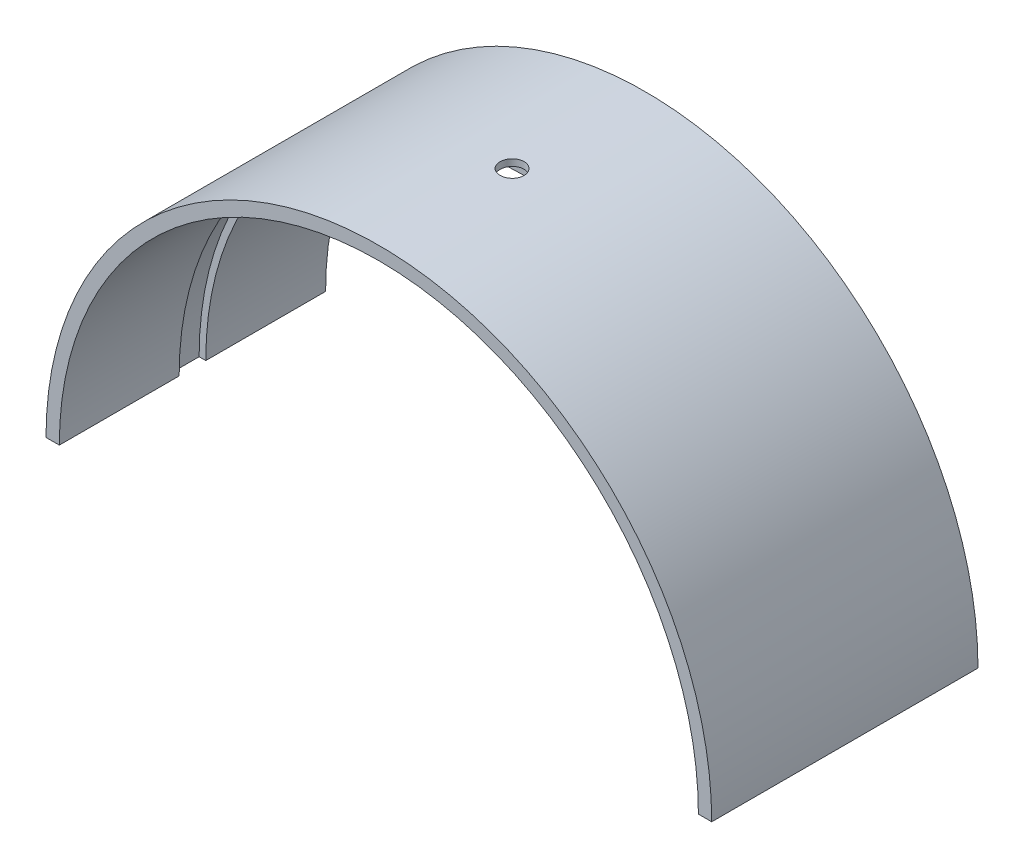
ISO-10303-21;
HEADER;
FILE_DESCRIPTION(('STEP AP214'),'2;1');
FILE_NAME('part.step','',(''),(''),'','','');
FILE_SCHEMA(('AUTOMOTIVE_DESIGN { 1 0 10303 214 1 1 1 1 }'));
ENDSEC;
DATA;
#1=APPLICATION_CONTEXT('core data for automotive mechanical design processes');
#2=APPLICATION_PROTOCOL_DEFINITION('international standard','automotive_design',2000,#1);
#3=PRODUCT_CONTEXT('',#1,'mechanical');
#4=PRODUCT('Part','Part','',(#3));
#5=PRODUCT_RELATED_PRODUCT_CATEGORY('part','',(#4));
#6=PRODUCT_DEFINITION_FORMATION('','',#4);
#7=PRODUCT_DEFINITION_CONTEXT('part definition',#1,'design');
#8=PRODUCT_DEFINITION('design','',#6,#7);
#9=PRODUCT_DEFINITION_SHAPE('','',#8);
#10=(LENGTH_UNIT() NAMED_UNIT(*) SI_UNIT(.MILLI.,.METRE.));
#11=(NAMED_UNIT(*) PLANE_ANGLE_UNIT() SI_UNIT($,.RADIAN.));
#12=(NAMED_UNIT(*) SI_UNIT($,.STERADIAN.) SOLID_ANGLE_UNIT());
#13=UNCERTAINTY_MEASURE_WITH_UNIT(LENGTH_MEASURE(1.E-05),#10,'distance_accuracy_value','');
#14=(GEOMETRIC_REPRESENTATION_CONTEXT(3) GLOBAL_UNCERTAINTY_ASSIGNED_CONTEXT((#13)) GLOBAL_UNIT_ASSIGNED_CONTEXT((#10,
#11,#12)) REPRESENTATION_CONTEXT('',''));
#15=CARTESIAN_POINT('',(0.,0.,0.));
#16=DIRECTION('',(0.,0.,1.));
#17=DIRECTION('',(1.,0.,0.));
#18=AXIS2_PLACEMENT_3D('',#15,#16,#17);
#19=CARTESIAN_POINT('',(0.,0.,20.));
#20=DIRECTION('',(0.,0.,-1.));
#21=DIRECTION('',(-1.,0.,0.));
#22=AXIS2_PLACEMENT_3D('',#19,#20,#21);
#23=CYLINDRICAL_SURFACE('',#22,24.);
#24=CARTESIAN_POINT('',(0.,0.,11.));
#25=DIRECTION('',(0.,0.,-1.));
#26=DIRECTION('',(-1.,0.,0.));
#27=AXIS2_PLACEMENT_3D('',#24,#25,#26);
#28=CIRCLE('',#27,24.);
#29=CARTESIAN_POINT('',(-24.,0.,11.));
#30=VERTEX_POINT('',#29);
#31=CARTESIAN_POINT('',(24.,0.,11.));
#32=VERTEX_POINT('',#31);
#33=EDGE_CURVE('E135',#30,#32,#28,.T.);
#34=ORIENTED_EDGE('',*,*,#33,.T.);
#35=DIRECTION('',(0.,0.,-1.));
#36=VECTOR('',#35,1.);
#37=CARTESIAN_POINT('',(24.,0.,20.));
#38=LINE('',#37,#36);
#39=CARTESIAN_POINT('',(24.,0.,20.));
#40=VERTEX_POINT('',#39);
#41=EDGE_CURVE('E129',#40,#32,#38,.T.);
#42=ORIENTED_EDGE('',*,*,#41,.F.);
#43=CARTESIAN_POINT('',(0.,0.,20.));
#44=DIRECTION('',(0.,0.,-1.));
#45=DIRECTION('',(1.,0.,0.));
#46=AXIS2_PLACEMENT_3D('',#43,#44,#45);
#47=CIRCLE('',#46,24.);
#48=CARTESIAN_POINT('',(-24.,0.,20.));
#49=VERTEX_POINT('',#48);
#50=EDGE_CURVE('E175',#49,#40,#47,.T.);
#51=ORIENTED_EDGE('',*,*,#50,.F.);
#52=DIRECTION('',(0.,0.,-1.));
#53=VECTOR('',#52,1.);
#54=CARTESIAN_POINT('',(-24.,0.,20.));
#55=LINE('',#54,#53);
#56=EDGE_CURVE('E144',#49,#30,#55,.T.);
#57=ORIENTED_EDGE('',*,*,#56,.T.);
#58=EDGE_LOOP('',(#34,#42,#51,#57));
#59=FACE_BOUND('',#58,.T.);
#60=ADVANCED_FACE('F43',(#59),#23,.F.);
#61=CARTESIAN_POINT('',(0.,0.,9.));
#62=DIRECTION('',(0.,0.,-1.));
#63=DIRECTION('',(-1.,0.,0.));
#64=AXIS2_PLACEMENT_3D('',#61,#62,#63);
#65=CIRCLE('',#64,24.);
#66=CARTESIAN_POINT('',(-24.,0.,9.));
#67=VERTEX_POINT('',#66);
#68=CARTESIAN_POINT('',(24.,0.,9.));
#69=VERTEX_POINT('',#68);
#70=EDGE_CURVE('E124',#67,#69,#65,.T.);
#71=ORIENTED_EDGE('',*,*,#70,.F.);
#72=CARTESIAN_POINT('',(-24.,0.,0.));
#73=VERTEX_POINT('',#72);
#74=EDGE_CURVE('E95',#67,#73,#55,.T.);
#75=ORIENTED_EDGE('',*,*,#74,.T.);
#76=CARTESIAN_POINT('',(0.,0.,0.));
#77=DIRECTION('',(0.,0.,-1.));
#78=DIRECTION('',(1.,0.,0.));
#79=AXIS2_PLACEMENT_3D('',#76,#77,#78);
#80=CIRCLE('',#79,24.);
#81=CARTESIAN_POINT('',(24.,0.,0.));
#82=VERTEX_POINT('',#81);
#83=EDGE_CURVE('E188',#73,#82,#80,.T.);
#84=ORIENTED_EDGE('',*,*,#83,.T.);
#85=EDGE_CURVE('E133',#69,#82,#38,.T.);
#86=ORIENTED_EDGE('',*,*,#85,.F.);
#87=EDGE_LOOP('',(#71,#75,#84,#86));
#88=FACE_BOUND('',#87,.T.);
#89=ADVANCED_FACE('F132',(#88),#23,.F.);
#90=CARTESIAN_POINT('',(24.,0.,20.));
#91=DIRECTION('',(0.,1.,0.));
#92=DIRECTION('',(0.,0.,1.));
#93=AXIS2_PLACEMENT_3D('',#90,#91,#92);
#94=PLANE('',#93);
#95=DIRECTION('',(-1.,0.,0.));
#96=VECTOR('',#95,1.);
#97=CARTESIAN_POINT('',(24.,0.,11.));
#98=LINE('',#97,#96);
#99=CARTESIAN_POINT('',(24.5,0.,11.));
#100=VERTEX_POINT('',#99);
#101=EDGE_CURVE('E207',#100,#32,#98,.T.);
#102=ORIENTED_EDGE('',*,*,#101,.F.);
#103=DIRECTION('',(0.,0.,-1.));
#104=VECTOR('',#103,1.);
#105=CARTESIAN_POINT('',(24.5,0.,0.));
#106=LINE('',#105,#104);
#107=CARTESIAN_POINT('',(24.5,0.,9.));
#108=VERTEX_POINT('',#107);
#109=EDGE_CURVE('E183',#108,#100,#106,.F.);
#110=ORIENTED_EDGE('',*,*,#109,.F.);
#111=DIRECTION('',(1.,0.,0.));
#112=VECTOR('',#111,1.);
#113=CARTESIAN_POINT('',(24.,0.,9.));
#114=LINE('',#113,#112);
#115=EDGE_CURVE('E204',#69,#108,#114,.T.);
#116=ORIENTED_EDGE('',*,*,#115,.F.);
#117=ORIENTED_EDGE('',*,*,#85,.T.);
#118=DIRECTION('',(1.,0.,0.));
#119=VECTOR('',#118,1.);
#120=CARTESIAN_POINT('',(24.,0.,0.));
#121=LINE('',#120,#119);
#122=CARTESIAN_POINT('',(25.,0.,0.));
#123=VERTEX_POINT('',#122);
#124=EDGE_CURVE('E191',#82,#123,#121,.T.);
#125=ORIENTED_EDGE('',*,*,#124,.T.);
#126=DIRECTION('',(0.,0.,-1.));
#127=VECTOR('',#126,1.);
#128=CARTESIAN_POINT('',(25.,0.,20.));
#129=LINE('',#128,#127);
#130=CARTESIAN_POINT('',(25.,0.,20.));
#131=VERTEX_POINT('',#130);
#132=EDGE_CURVE('E157',#131,#123,#129,.T.);
#133=ORIENTED_EDGE('',*,*,#132,.F.);
#134=DIRECTION('',(1.,0.,0.));
#135=VECTOR('',#134,1.);
#136=CARTESIAN_POINT('',(24.,0.,20.));
#137=LINE('',#136,#135);
#138=EDGE_CURVE('E103',#40,#131,#137,.T.);
#139=ORIENTED_EDGE('',*,*,#138,.F.);
#140=ORIENTED_EDGE('',*,*,#41,.T.);
#141=EDGE_LOOP('',(#102,#110,#116,#117,#125,#133,#139,#140));
#142=FACE_BOUND('',#141,.T.);
#143=ADVANCED_FACE('F203',(#142),#94,.F.);
#144=CARTESIAN_POINT('',(-25.,0.,20.));
#145=DIRECTION('',(0.,1.,0.));
#146=DIRECTION('',(0.,0.,1.));
#147=AXIS2_PLACEMENT_3D('',#144,#145,#146);
#148=PLANE('',#147);
#149=DIRECTION('',(-1.,0.,0.));
#150=VECTOR('',#149,1.);
#151=CARTESIAN_POINT('',(-25.,0.,11.));
#152=LINE('',#151,#150);
#153=CARTESIAN_POINT('',(-24.5,0.,11.));
#154=VERTEX_POINT('',#153);
#155=EDGE_CURVE('E11',#30,#154,#152,.T.);
#156=ORIENTED_EDGE('',*,*,#155,.F.);
#157=ORIENTED_EDGE('',*,*,#56,.F.);
#158=DIRECTION('',(1.,0.,0.));
#159=VECTOR('',#158,1.);
#160=CARTESIAN_POINT('',(-25.,0.,20.));
#161=LINE('',#160,#159);
#162=CARTESIAN_POINT('',(-25.,0.,20.));
#163=VERTEX_POINT('',#162);
#164=EDGE_CURVE('E73',#163,#49,#161,.T.);
#165=ORIENTED_EDGE('',*,*,#164,.F.);
#166=DIRECTION('',(0.,0.,-1.));
#167=VECTOR('',#166,1.);
#168=CARTESIAN_POINT('',(-25.,0.,20.));
#169=LINE('',#168,#167);
#170=CARTESIAN_POINT('',(-25.,0.,0.));
#171=VERTEX_POINT('',#170);
#172=EDGE_CURVE('E149',#163,#171,#169,.T.);
#173=ORIENTED_EDGE('',*,*,#172,.T.);
#174=DIRECTION('',(1.,0.,0.));
#175=VECTOR('',#174,1.);
#176=CARTESIAN_POINT('',(-25.,0.,0.));
#177=LINE('',#176,#175);
#178=EDGE_CURVE('E141',#171,#73,#177,.T.);
#179=ORIENTED_EDGE('',*,*,#178,.T.);
#180=ORIENTED_EDGE('',*,*,#74,.F.);
#181=DIRECTION('',(1.,0.,0.));
#182=VECTOR('',#181,1.);
#183=CARTESIAN_POINT('',(-25.,0.,9.));
#184=LINE('',#183,#182);
#185=CARTESIAN_POINT('',(-24.5,0.,9.));
#186=VERTEX_POINT('',#185);
#187=EDGE_CURVE('E122',#186,#67,#184,.T.);
#188=ORIENTED_EDGE('',*,*,#187,.F.);
#189=DIRECTION('',(0.,0.,-1.));
#190=VECTOR('',#189,1.);
#191=CARTESIAN_POINT('',(-24.5,0.,0.));
#192=LINE('',#191,#190);
#193=EDGE_CURVE('E57',#154,#186,#192,.T.);
#194=ORIENTED_EDGE('',*,*,#193,.F.);
#195=EDGE_LOOP('',(#156,#157,#165,#173,#179,#180,#188,#194));
#196=FACE_BOUND('',#195,.T.);
#197=ADVANCED_FACE('F138',(#196),#148,.F.);
#198=CARTESIAN_POINT('',(0.,0.,20.));
#199=DIRECTION('',(0.,0.,-1.));
#200=DIRECTION('',(-1.,0.,0.));
#201=AXIS2_PLACEMENT_3D('',#198,#199,#200);
#202=CYLINDRICAL_SURFACE('',#201,25.);
#203=CARTESIAN_POINT('',(0.,25.,9.1));
#204=CARTESIAN_POINT('',(0.050535829957511,24.9999997821146,9.10000223564241));
#205=CARTESIAN_POINT('',(0.101107886204852,24.9998451246391,9.10427073954814));
#206=CARTESIAN_POINT('',(0.200858013351447,24.9992430331769,9.12123874042541));
#207=CARTESIAN_POINT('',(0.250034351978574,24.998795250655,9.13394827432343));
#208=CARTESIAN_POINT('',(0.345533557905941,24.9976576121728,9.16743497476834));
#209=CARTESIAN_POINT('',(0.391857822470569,24.996967875876,9.18820815381038));
#210=CARTESIAN_POINT('',(0.480348825067872,24.9954241009306,9.23722664781565));
#211=CARTESIAN_POINT('',(0.522516566319997,24.9945701020761,9.26547015364747));
#212=CARTESIAN_POINT('',(0.601535420471143,24.992793372449,9.3286468030275));
#213=CARTESIAN_POINT('',(0.638383816447171,24.9918706069153,9.36358334407803));
#214=CARTESIAN_POINT('',(0.705695009782055,24.9900606494127,9.43914805243734));
#215=CARTESIAN_POINT('',(0.736157551232679,24.9891734588706,9.47977644773403));
#216=CARTESIAN_POINT('',(0.789837938182272,24.9875344936121,9.5655834282216));
#217=CARTESIAN_POINT('',(0.813053945584977,24.9867827532734,9.61076316403034));
#218=CARTESIAN_POINT('',(0.851570367321573,24.9854998231692,9.70438218213384));
#219=CARTESIAN_POINT('',(0.866870820397095,24.9849686323244,9.75282144847396));
#220=CARTESIAN_POINT('',(0.889115403017304,24.9841869777321,9.85156209121391));
#221=CARTESIAN_POINT('',(0.896063182768703,24.9839363913608,9.90186264429819));
#222=CARTESIAN_POINT('',(0.901416448483106,24.9837438327537,10.0029166896937));
#223=CARTESIAN_POINT('',(0.899821976784824,24.9838018589883,10.0536701797587));
#224=CARTESIAN_POINT('',(0.888139067220623,24.9842198679703,10.1541646240054));
#225=CARTESIAN_POINT('',(0.878054572670542,24.9845797105345,10.2039060372782));
#226=CARTESIAN_POINT('',(0.8496839828355,24.9855605683101,10.300989480446));
#227=CARTESIAN_POINT('',(0.831397865374745,24.9861815842279,10.348331503853));
#228=CARTESIAN_POINT('',(0.787138584095716,24.9876149471606,10.4392850030083));
#229=CARTESIAN_POINT('',(0.761163615103001,24.9884273390974,10.4828955995961));
#230=CARTESIAN_POINT('',(0.702265296005424,24.9901518306294,10.5651386661282));
#231=CARTESIAN_POINT('',(0.669341921810511,24.9910639305703,10.6037711188125));
#232=CARTESIAN_POINT('',(0.597459074243739,24.9928856456015,10.6749842280802));
#233=CARTESIAN_POINT('',(0.558496183141841,24.9937952589862,10.7075614349345));
#234=CARTESIAN_POINT('',(0.475652359994273,24.9955089649375,10.7657127387105));
#235=CARTESIAN_POINT('',(0.431771427065669,24.9963130574851,10.791286834375));
#236=CARTESIAN_POINT('',(0.340335197237806,24.9977251006856,10.8347055889489));
#237=CARTESIAN_POINT('',(0.29277984736518,24.9983330485101,10.8525501363983));
#238=CARTESIAN_POINT('',(0.195345578500072,24.9992842304056,10.880001037052));
#239=CARTESIAN_POINT('',(0.14546666857177,24.9996274655093,10.8896074223905));
#240=CARTESIAN_POINT('',(0.0448311307414569,25.0000104006701,10.9003050750168));
#241=CARTESIAN_POINT('',(-0.00592498917054768,25.0000502708673,10.9014011152814));
#242=CARTESIAN_POINT('',(-0.106900491218682,24.9998224330805,10.8950594077958));
#243=CARTESIAN_POINT('',(-0.157119874261571,24.9995547256163,10.8876216744647));
#244=CARTESIAN_POINT('',(-0.25558303287527,24.9987420084713,10.8644275002465));
#245=CARTESIAN_POINT('',(-0.303827320309746,24.998197071135,10.8486732295592));
#246=CARTESIAN_POINT('',(-0.396986537117233,24.9968912870011,10.8092953881289));
#247=CARTESIAN_POINT('',(-0.441901456694551,24.9961304395681,10.7856717942339));
#248=CARTESIAN_POINT('',(-0.527148923451362,24.9944780920711,10.731213620439));
#249=CARTESIAN_POINT('',(-0.567479419373229,24.9935865339271,10.7003758313391));
#250=CARTESIAN_POINT('',(-0.642392596182118,24.9917734198405,10.6323693453455));
#251=CARTESIAN_POINT('',(-0.67697525691377,24.9908518637927,10.5952006262528));
#252=CARTESIAN_POINT('',(-0.739427060525725,24.9890821545523,10.5155668902303));
#253=CARTESIAN_POINT('',(-0.767293121780839,24.9882340351669,10.4730994557205));
#254=CARTESIAN_POINT('',(-0.815499648963938,24.9867073559729,10.3840860813006));
#255=CARTESIAN_POINT('',(-0.835840135779762,24.9860287956937,10.337540152711));
#256=CARTESIAN_POINT('',(-0.868412726007746,24.9849179852326,10.2417026143968));
#257=CARTESIAN_POINT('',(-0.880646815933241,24.9844856747097,10.1924116805615));
#258=CARTESIAN_POINT('',(-0.89666583880174,24.9839159380231,10.0924737829479));
#259=CARTESIAN_POINT('',(-0.900450789183601,24.9837785112507,10.0418268219685));
#260=CARTESIAN_POINT('',(-0.899463868530838,24.9838140585843,9.94064532152565));
#261=CARTESIAN_POINT('',(-0.894696852396149,24.9839868565775,9.89011073457339));
#262=CARTESIAN_POINT('',(-0.876751318545876,24.9846230038243,9.79055969011896));
#263=CARTESIAN_POINT('',(-0.863572784289525,24.9850863536493,9.74154323560232));
#264=CARTESIAN_POINT('',(-0.829179113282818,24.9862513412054,9.64641835607139));
#265=CARTESIAN_POINT('',(-0.807963855236856,24.9869529825331,9.60030997495994));
#266=CARTESIAN_POINT('',(-0.758100236851855,24.9885154321198,9.51231002781494));
#267=CARTESIAN_POINT('',(-0.729452135203475,24.9893762348391,9.47041831509602));
#268=CARTESIAN_POINT('',(-0.665520265833701,24.9911604969519,9.39201762033073));
#269=CARTESIAN_POINT('',(-0.630233447226495,24.992083985028,9.35551112692981));
#270=CARTESIAN_POINT('',(-0.554021581378665,24.9938894477835,9.28892993773176));
#271=CARTESIAN_POINT('',(-0.51309514246935,24.994771412144,9.2588568341688));
#272=CARTESIAN_POINT('',(-0.426745822875753,24.9963947970882,9.20598878830162));
#273=CARTESIAN_POINT('',(-0.381319707298788,24.9971361154264,9.18319913267028));
#274=CARTESIAN_POINT('',(-0.287318176228993,24.9983929187085,9.14559669340345));
#275=CARTESIAN_POINT('',(-0.238746584932447,24.9989086721837,9.13077441988837));
#276=CARTESIAN_POINT('',(-0.158224503224093,24.9995187407918,9.11344562439819));
#277=CARTESIAN_POINT('',(-0.12679640493848,24.999698427448,9.10840988248285));
#278=CARTESIAN_POINT('',(-0.0635836521312206,24.9999391255774,9.1016863676272));
#279=CARTESIAN_POINT('',(-0.0317989977624168,25.0000001371015,9.0999985932518));
#280=CARTESIAN_POINT('',(0.,25.,9.1));
#281=B_SPLINE_CURVE_WITH_KNOTS('',3,(#203,#204,#205,#206,#207,#208,#209,#210,#211,#212,#213,
#214,#215,#216,#217,#218,#219,#220,#221,#222,#223,#224,#225,#226,#227,#228,#229,#230,#231,#232,
#233,#234,#235,#236,#237,#238,#239,#240,#241,#242,#243,#244,#245,#246,#247,#248,#249,#250,#251,
#252,#253,#254,#255,#256,#257,#258,#259,#260,#261,#262,#263,#264,#265,#266,#267,#268,#269,#270,
#271,#272,#273,#274,#275,#276,#277,#278,#279,#280),.UNSPECIFIED.,.T.,.F.,(4,2,2,2,2,2,2,2,2,2,2,
2,2,2,2,2,2,2,2,2,2,2,2,2,2,2,2,2,2,2,2,2,2,2,2,2,2,2,4),(0.,0.151491417505848,
0.303163291306592,0.454760258108646,0.606320545375004,0.757957972141803,0.90960147450119,
1.06128341030584,1.21296460371633,1.36457948671512,1.51619361825238,1.66773736920404,
1.81928152990669,1.97086129812668,2.12244159188085,2.27410797939034,2.42577439412844,
2.57744299582035,2.72911100590436,2.8806939477326,3.03227663343709,3.18381978318972,
3.33536337879607,3.48697451646394,3.63858618576051,3.79026728375719,3.94194796074764,
4.09359145386488,4.24523463399265,4.39679175443925,4.54834917291511,4.69990887888794,
4.85146331072557,5.00308756173752,5.15474929574461,5.30652086434365,5.45811125630726,
5.5534352534642,5.64875920976103),.UNSPECIFIED.);
#282=CARTESIAN_POINT('',(0.,25.,9.1));
#283=VERTEX_POINT('',#282);
#284=EDGE_CURVE('E217',#283,#283,#281,.T.);
#285=ORIENTED_EDGE('',*,*,#284,.T.);
#286=EDGE_LOOP('',(#285));
#287=FACE_BOUND('',#286,.T.);
#288=CARTESIAN_POINT('',(0.,0.,0.));
#289=DIRECTION('',(0.,0.,1.));
#290=DIRECTION('',(1.,0.,0.));
#291=AXIS2_PLACEMENT_3D('',#288,#289,#290);
#292=CIRCLE('',#291,25.);
#293=EDGE_CURVE('E181',#123,#171,#292,.T.);
#294=ORIENTED_EDGE('',*,*,#293,.T.);
#295=ORIENTED_EDGE('',*,*,#172,.F.);
#296=CARTESIAN_POINT('',(0.,0.,20.));
#297=DIRECTION('',(0.,0.,1.));
#298=DIRECTION('',(1.,0.,0.));
#299=AXIS2_PLACEMENT_3D('',#296,#297,#298);
#300=CIRCLE('',#299,25.);
#301=EDGE_CURVE('E150',#131,#163,#300,.T.);
#302=ORIENTED_EDGE('',*,*,#301,.F.);
#303=ORIENTED_EDGE('',*,*,#132,.T.);
#304=EDGE_LOOP('',(#294,#295,#302,#303));
#305=FACE_BOUND('',#304,.T.);
#306=ADVANCED_FACE('F197',(#287,#305),#202,.T.);
#307=CARTESIAN_POINT('',(0.,0.,20.));
#308=DIRECTION('',(0.,0.,1.));
#309=DIRECTION('',(1.,0.,0.));
#310=AXIS2_PLACEMENT_3D('',#307,#308,#309);
#311=PLANE('',#310);
#312=ORIENTED_EDGE('',*,*,#50,.T.);
#313=ORIENTED_EDGE('',*,*,#138,.T.);
#314=ORIENTED_EDGE('',*,*,#301,.T.);
#315=ORIENTED_EDGE('',*,*,#164,.T.);
#316=EDGE_LOOP('',(#312,#313,#314,#315));
#317=FACE_BOUND('',#316,.T.);
#318=ADVANCED_FACE('F240',(#317),#311,.T.);
#319=CARTESIAN_POINT('',(0.,0.,0.));
#320=DIRECTION('',(0.,0.,1.));
#321=DIRECTION('',(1.,0.,0.));
#322=AXIS2_PLACEMENT_3D('',#319,#320,#321);
#323=PLANE('',#322);
#324=ORIENTED_EDGE('',*,*,#83,.F.);
#325=ORIENTED_EDGE('',*,*,#178,.F.);
#326=ORIENTED_EDGE('',*,*,#293,.F.);
#327=ORIENTED_EDGE('',*,*,#124,.F.);
#328=EDGE_LOOP('',(#324,#325,#326,#327));
#329=FACE_BOUND('',#328,.T.);
#330=ADVANCED_FACE('F201',(#329),#323,.F.);
#331=CARTESIAN_POINT('',(0.,0.,0.));
#332=DIRECTION('',(0.,0.,-1.));
#333=DIRECTION('',(-1.,0.,0.));
#334=AXIS2_PLACEMENT_3D('',#331,#332,#333);
#335=CYLINDRICAL_SURFACE('',#334,24.5);
#336=CARTESIAN_POINT('',(0.,24.5,9.1));
#337=CARTESIAN_POINT('',(0.0505351060782391,24.4999997777193,9.10000223538102));
#338=CARTESIAN_POINT('',(0.101106420724203,24.4998419685368,9.10427061748716));
#339=CARTESIAN_POINT('',(0.200855035460117,24.499227607288,9.1212381063636));
#340=CARTESIAN_POINT('',(0.250030604068245,24.4987706997461,9.13394724515907));
#341=CARTESIAN_POINT('',(0.345528266124883,24.4976098771127,9.16743283446827));
#342=CARTESIAN_POINT('',(0.391851758754187,24.4969060842924,9.18820529212123));
#343=CARTESIAN_POINT('',(0.480341370296564,24.4953308430445,9.23722202121835));
#344=CARTESIAN_POINT('',(0.522508491280468,24.4944594351779,9.26546448562059));
#345=CARTESIAN_POINT('',(0.601527041724291,24.4926464614145,9.32863931582851));
#346=CARTESIAN_POINT('',(0.638375665502354,24.4917048588819,9.36357519017532));
#347=CARTESIAN_POINT('',(0.705687480975213,24.4898579404172,9.43913860415428));
#348=CARTESIAN_POINT('',(0.736150416552575,24.4889526259416,9.47976637196812));
#349=CARTESIAN_POINT('',(0.789832073100562,24.4872801553044,9.56557272413134));
#350=CARTESIAN_POINT('',(0.81304887440522,24.4865130357765,9.6107525102277));
#351=CARTESIAN_POINT('',(0.851566823368687,24.4852038483768,9.70437189616067));
#352=CARTESIAN_POINT('',(0.866868010713494,24.4846617793767,9.75281147965248));
#353=CARTESIAN_POINT('',(0.889113712393846,24.4838641141696,9.85155208541579));
#354=CARTESIAN_POINT('',(0.896062027972267,24.4836083876569,9.90185225021922));
#355=CARTESIAN_POINT('',(0.901416467016089,24.4834118511139,10.0029056369599));
#356=CARTESIAN_POINT('',(0.899822633931691,24.4834710394818,10.0536588565914));
#357=CARTESIAN_POINT('',(0.888141209918508,24.4838975368855,10.1541518593652));
#358=CARTESIAN_POINT('',(0.878057725236362,24.4842646969622,10.203892120542));
#359=CARTESIAN_POINT('',(0.849689587459662,24.4852655154777,10.3009734293539));
#360=CARTESIAN_POINT('',(0.83140491163499,24.4858991746551,10.348314470339));
#361=CARTESIAN_POINT('',(0.787148718762686,24.4873617351961,10.4392667290833));
#362=CARTESIAN_POINT('',(0.761175322276081,24.4881906842865,10.4828770315334));
#363=CARTESIAN_POINT('',(0.702280362135567,24.4899503325209,10.5651198481201));
#364=CARTESIAN_POINT('',(0.669358773284215,24.490881032034,10.603752344204));
#365=CARTESIAN_POINT('',(0.597478740517277,24.4927399316147,10.6749668253185));
#366=CARTESIAN_POINT('',(0.558516737859197,24.4936681298785,10.707545218503));
#367=CARTESIAN_POINT('',(0.475674405472432,24.4954168654581,10.7656990514857));
#368=CARTESIAN_POINT('',(0.43179407484838,24.4962374027542,10.7912744900091));
#369=CARTESIAN_POINT('',(0.340358662170344,24.4976783434958,10.8346960357738));
#370=CARTESIAN_POINT('',(0.292803524755661,24.4982987439255,10.8525420265448));
#371=CARTESIAN_POINT('',(0.195369323657861,24.4992694331828,10.8799957854731));
#372=CARTESIAN_POINT('',(0.145490269410039,24.4996197231071,10.889603587075));
#373=CARTESIAN_POINT('',(0.0448553230308332,24.5000105668965,10.9003038284925));
#374=CARTESIAN_POINT('',(-0.00590004003000953,24.5000513015234,10.9014012378723));
#375=CARTESIAN_POINT('',(-0.106874255094776,24.4998189223698,10.8950624991286));
#376=CARTESIAN_POINT('',(-0.157093108043517,24.499545809142,10.8876263660356));
#377=CARTESIAN_POINT('',(-0.25555489779959,24.4987166255881,10.8644357400135));
#378=CARTESIAN_POINT('',(-0.303798367607939,24.4981606321401,10.8486835070987));
#379=CARTESIAN_POINT('',(-0.396956315781611,24.4968283246329,10.8093101218721));
#380=CARTESIAN_POINT('',(-0.441870783933727,24.496052009898,10.78568894542));
#381=CARTESIAN_POINT('',(-0.527118630317461,24.4943660278986,10.7312354151267));
#382=CARTESIAN_POINT('',(-0.567449873222021,24.4934562989249,10.7003997203359));
#383=CARTESIAN_POINT('',(-0.642364960123,24.4916062004816,10.6323973643767));
#384=CARTESIAN_POINT('',(-0.676948783226594,24.4906658309007,10.5952306801951));
#385=CARTESIAN_POINT('',(-0.739403957700735,24.4888599417767,10.5156000512098));
#386=CARTESIAN_POINT('',(-0.767272100258646,24.4879944581409,10.4731335887755));
#387=CARTESIAN_POINT('',(-0.815482908665854,24.4864364888819,10.384121671765));
#388=CARTESIAN_POINT('',(-0.835825595932534,24.4857440027664,10.337576228798));
#389=CARTESIAN_POINT('',(-0.868402421095068,24.4846103645958,10.2417396316347));
#390=CARTESIAN_POINT('',(-0.880638626446128,24.4841691484615,10.1924491809968));
#391=CARTESIAN_POINT('',(-0.896661918695542,24.4835876183772,10.0925118202634));
#392=CARTESIAN_POINT('',(-0.900449024383912,24.483447303758,10.0418649131849));
#393=CARTESIAN_POINT('',(-0.899466382713746,24.4834834202253,9.94068435131579));
#394=CARTESIAN_POINT('',(-0.894701690063422,24.4836596642037,9.8901506472898));
#395=CARTESIAN_POINT('',(-0.876761119269287,24.4843086367023,9.79060099304162));
#396=CARTESIAN_POINT('',(-0.863585224604652,24.484781365805,9.74158504580073));
#397=CARTESIAN_POINT('',(-0.829197121319196,24.485969985683,9.64646076528486));
#398=CARTESIAN_POINT('',(-0.807984793438202,24.486685880067,9.60035247517118));
#399=CARTESIAN_POINT('',(-0.75812725573536,24.488280103116,9.51235216845745));
#400=CARTESIAN_POINT('',(-0.729482303233341,24.4891584261576,9.47046000596339));
#401=CARTESIAN_POINT('',(-0.665556073380794,24.4909790575738,9.39205683877686));
#402=CARTESIAN_POINT('',(-0.630271590846079,24.4919213967107,9.35554844830705));
#403=CARTESIAN_POINT('',(-0.554064051327019,24.4937637478822,9.28896304689808));
#404=CARTESIAN_POINT('',(-0.513139602892659,24.4946637493979,9.2588876277407));
#405=CARTESIAN_POINT('',(-0.426793327767193,24.4963203812061,9.20601430082854));
#406=CARTESIAN_POINT('',(-0.381368219856143,24.4970769057078,9.18322175458831));
#407=CARTESIAN_POINT('',(-0.287368054038594,24.498359532988,9.14561344019055));
#408=CARTESIAN_POINT('',(-0.238796819865822,24.4988859096665,9.13078818527765));
#409=CARTESIAN_POINT('',(-0.158266803914835,24.4995086559252,9.1134528680171));
#410=CARTESIAN_POINT('',(-0.126830430064506,24.4996921076025,9.10841441626923));
#411=CARTESIAN_POINT('',(-0.0636008188793684,24.4999378495662,9.10168727951747));
#412=CARTESIAN_POINT('',(-0.0318075817040649,24.5000001399069,9.09999859301642));
#413=CARTESIAN_POINT('',(0.,24.5,9.1));
#414=B_SPLINE_CURVE_WITH_KNOTS('',3,(#336,#337,#338,#339,#340,#341,#342,#343,#344,#345,#346,
#347,#348,#349,#350,#351,#352,#353,#354,#355,#356,#357,#358,#359,#360,#361,#362,#363,#364,#365,
#366,#367,#368,#369,#370,#371,#372,#373,#374,#375,#376,#377,#378,#379,#380,#381,#382,#383,#384,
#385,#386,#387,#388,#389,#390,#391,#392,#393,#394,#395,#396,#397,#398,#399,#400,#401,#402,#403,
#404,#405,#406,#407,#408,#409,#410,#411,#412,#413),.UNSPECIFIED.,.T.,.F.,(4,2,2,2,2,2,2,2,2,2,2,
2,2,2,2,2,2,2,2,2,2,2,2,2,2,2,2,2,2,2,2,2,2,2,2,2,2,2,4),(0.,0.151489214279058,
0.303158799800879,0.454753375939524,0.606311313877181,0.757948913650054,0.909592594146601,
1.06127641447353,1.21295947430577,1.36457347972142,1.51618671394318,1.66772665847641,
1.81926702301472,1.97084446087038,2.12242244842719,2.27409008074402,2.42575774067162,
2.57742768590722,2.72909701540396,2.88067777233702,3.03225826228573,3.18379757934336,
3.33533736129664,3.48694745873901,3.6385581072972,3.79024105378945,3.94192356858998,
4.09356738378506,4.24521086173799,4.39676473735314,4.54831891064307,4.69987533307567,
4.85142650927658,5.00305103425648,5.15471303409084,5.30648642877394,5.45807870226744,
5.55342841236032,5.64877807983713),.UNSPECIFIED.);
#415=CARTESIAN_POINT('',(0.,24.5,9.1));
#416=VERTEX_POINT('',#415);
#417=EDGE_CURVE('E46',#416,#416,#414,.T.);
#418=ORIENTED_EDGE('',*,*,#417,.F.);
#419=EDGE_LOOP('',(#418));
#420=FACE_BOUND('',#419,.T.);
#421=ORIENTED_EDGE('',*,*,#109,.T.);
#422=CARTESIAN_POINT('',(0.,0.,11.));
#423=DIRECTION('',(0.,0.,-1.));
#424=DIRECTION('',(-1.,0.,0.));
#425=AXIS2_PLACEMENT_3D('',#422,#423,#424);
#426=CIRCLE('',#425,24.5);
#427=EDGE_CURVE('E169',#154,#100,#426,.T.);
#428=ORIENTED_EDGE('',*,*,#427,.F.);
#429=ORIENTED_EDGE('',*,*,#193,.T.);
#430=CARTESIAN_POINT('',(0.,0.,9.));
#431=DIRECTION('',(0.,0.,-1.));
#432=DIRECTION('',(-1.,0.,0.));
#433=AXIS2_PLACEMENT_3D('',#430,#431,#432);
#434=CIRCLE('',#433,24.5);
#435=EDGE_CURVE('E64',#186,#108,#434,.T.);
#436=ORIENTED_EDGE('',*,*,#435,.T.);
#437=EDGE_LOOP('',(#421,#428,#429,#436));
#438=FACE_BOUND('',#437,.T.);
#439=ADVANCED_FACE('F166',(#420,#438),#335,.F.);
#440=CARTESIAN_POINT('',(-24.5,0.,11.));
#441=DIRECTION('',(0.,0.,-1.));
#442=DIRECTION('',(-1.,0.,0.));
#443=AXIS2_PLACEMENT_3D('',#440,#441,#442);
#444=PLANE('',#443);
#445=ORIENTED_EDGE('',*,*,#101,.T.);
#446=ORIENTED_EDGE('',*,*,#33,.F.);
#447=ORIENTED_EDGE('',*,*,#155,.T.);
#448=ORIENTED_EDGE('',*,*,#427,.T.);
#449=EDGE_LOOP('',(#445,#446,#447,#448));
#450=FACE_BOUND('',#449,.T.);
#451=ADVANCED_FACE('F234',(#450),#444,.T.);
#452=CARTESIAN_POINT('',(-24.5,0.,9.));
#453=DIRECTION('',(0.,0.,1.));
#454=DIRECTION('',(1.,0.,0.));
#455=AXIS2_PLACEMENT_3D('',#452,#453,#454);
#456=PLANE('',#455);
#457=ORIENTED_EDGE('',*,*,#115,.T.);
#458=ORIENTED_EDGE('',*,*,#435,.F.);
#459=ORIENTED_EDGE('',*,*,#187,.T.);
#460=ORIENTED_EDGE('',*,*,#70,.T.);
#461=EDGE_LOOP('',(#457,#458,#459,#460));
#462=FACE_BOUND('',#461,.T.);
#463=ADVANCED_FACE('F123',(#462),#456,.T.);
#464=CARTESIAN_POINT('',(0.,25.,10.));
#465=DIRECTION('',(0.,-1.,0.));
#466=DIRECTION('',(0.,0.,-1.));
#467=AXIS2_PLACEMENT_3D('',#464,#465,#466);
#468=CYLINDRICAL_SURFACE('',#467,0.9);
#469=ORIENTED_EDGE('',*,*,#417,.T.);
#470=EDGE_LOOP('',(#469));
#471=FACE_BOUND('',#470,.T.);
#472=ORIENTED_EDGE('',*,*,#284,.F.);
#473=EDGE_LOOP('',(#472));
#474=FACE_BOUND('',#473,.T.);
#475=ADVANCED_FACE('F226',(#471,#474),#468,.F.);
#476=CLOSED_SHELL('',(#60,#89,#143,#197,#306,#318,#330,#439,#451,#463,#475));
#477=MANIFOLD_SOLID_BREP('B2',#476);
#478=ADVANCED_BREP_SHAPE_REPRESENTATION('',(#18,#477),#14);
#479=SHAPE_DEFINITION_REPRESENTATION(#9,#478);
ENDSEC;
END-ISO-10303-21;
